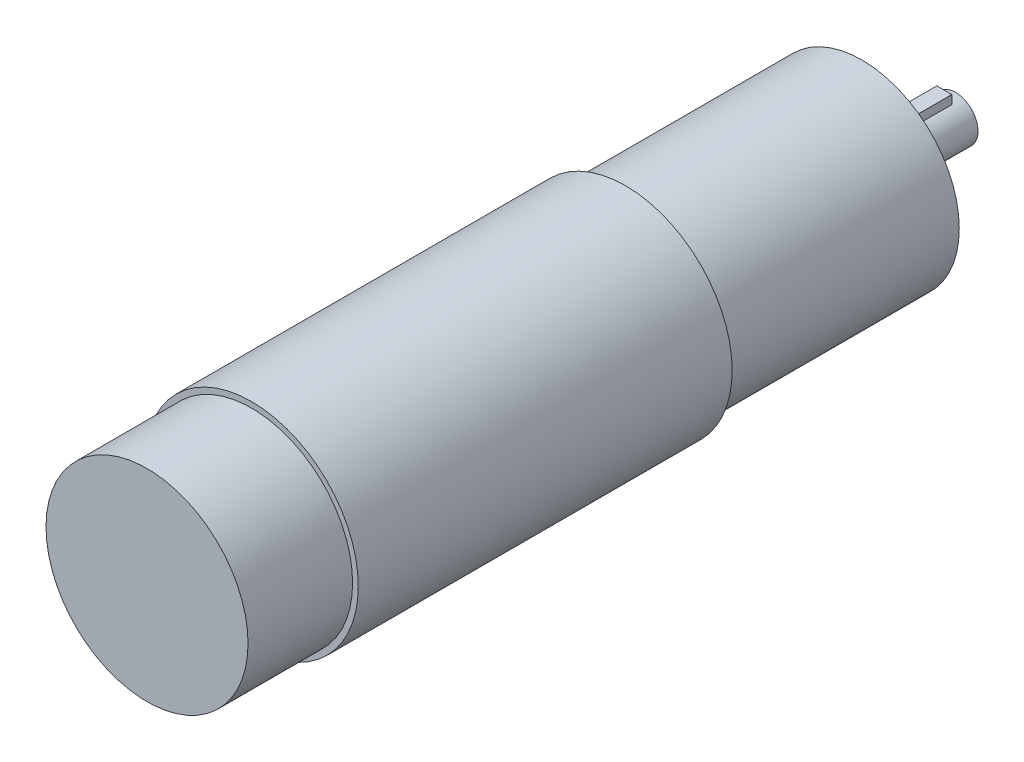
ISO-10303-21;
HEADER;
FILE_DESCRIPTION(('STEP AP214'),'2;1');
FILE_NAME('part.step','',(''),(''),'','','');
FILE_SCHEMA(('AUTOMOTIVE_DESIGN { 1 0 10303 214 1 1 1 1 }'));
ENDSEC;
DATA;
#1=APPLICATION_CONTEXT('core data for automotive mechanical design processes');
#2=APPLICATION_PROTOCOL_DEFINITION('international standard','automotive_design',2000,#1);
#3=PRODUCT_CONTEXT('',#1,'mechanical');
#4=PRODUCT('Part','Part','',(#3));
#5=PRODUCT_RELATED_PRODUCT_CATEGORY('part','',(#4));
#6=PRODUCT_DEFINITION_FORMATION('','',#4);
#7=PRODUCT_DEFINITION_CONTEXT('part definition',#1,'design');
#8=PRODUCT_DEFINITION('design','',#6,#7);
#9=PRODUCT_DEFINITION_SHAPE('','',#8);
#10=(LENGTH_UNIT() NAMED_UNIT(*) SI_UNIT(.MILLI.,.METRE.));
#11=(NAMED_UNIT(*) PLANE_ANGLE_UNIT() SI_UNIT($,.RADIAN.));
#12=(NAMED_UNIT(*) SI_UNIT($,.STERADIAN.) SOLID_ANGLE_UNIT());
#13=UNCERTAINTY_MEASURE_WITH_UNIT(LENGTH_MEASURE(1.E-05),#10,'distance_accuracy_value','');
#14=(GEOMETRIC_REPRESENTATION_CONTEXT(3) GLOBAL_UNCERTAINTY_ASSIGNED_CONTEXT((#13)) GLOBAL_UNIT_ASSIGNED_CONTEXT((#10,
#11,#12)) REPRESENTATION_CONTEXT('',''));
#15=CARTESIAN_POINT('',(0.,0.,0.));
#16=DIRECTION('',(0.,0.,1.));
#17=DIRECTION('',(1.,0.,0.));
#18=AXIS2_PLACEMENT_3D('',#15,#16,#17);
#19=CARTESIAN_POINT('',(0.,0.,0.));
#20=DIRECTION('',(0.,0.,-1.));
#21=DIRECTION('',(-1.,0.,0.));
#22=AXIS2_PLACEMENT_3D('',#19,#20,#21);
#23=PLANE('',#22);
#24=CARTESIAN_POINT('',(0.,0.,0.));
#25=DIRECTION('',(0.,0.,1.));
#26=DIRECTION('',(1.,0.,0.));
#27=AXIS2_PLACEMENT_3D('',#24,#25,#26);
#28=CIRCLE('',#27,26.9875);
#29=CARTESIAN_POINT('',(26.9875,0.,0.));
#30=VERTEX_POINT('',#29);
#31=EDGE_CURVE('E139',#30,#30,#28,.T.);
#32=ORIENTED_EDGE('',*,*,#31,.T.);
#33=EDGE_LOOP('',(#32));
#34=FACE_BOUND('',#33,.T.);
#35=ADVANCED_FACE('F33',(#34),#23,.F.);
#36=CARTESIAN_POINT('',(0.,0.,10.8794824996258));
#37=DIRECTION('',(0.,0.,1.));
#38=DIRECTION('',(1.,0.,0.));
#39=AXIS2_PLACEMENT_3D('',#36,#37,#38);
#40=CYLINDRICAL_SURFACE('',#39,26.9875);
#41=ORIENTED_EDGE('',*,*,#31,.F.);
#42=EDGE_LOOP('',(#41));
#43=FACE_BOUND('',#42,.T.);
#44=CARTESIAN_POINT('',(0.,0.,-27.94));
#45=DIRECTION('',(0.,0.,1.));
#46=DIRECTION('',(1.,0.,0.));
#47=AXIS2_PLACEMENT_3D('',#44,#45,#46);
#48=CIRCLE('',#47,26.9875);
#49=CARTESIAN_POINT('',(26.9875,0.,-27.94));
#50=VERTEX_POINT('',#49);
#51=EDGE_CURVE('E136',#50,#50,#48,.T.);
#52=ORIENTED_EDGE('',*,*,#51,.T.);
#53=EDGE_LOOP('',(#52));
#54=FACE_BOUND('',#53,.T.);
#55=ADVANCED_FACE('F163',(#43,#54),#40,.T.);
#56=CARTESIAN_POINT('',(0.,26.9875,-27.94));
#57=DIRECTION('',(0.,0.,-1.));
#58=DIRECTION('',(-1.,0.,0.));
#59=AXIS2_PLACEMENT_3D('',#56,#57,#58);
#60=PLANE('',#59);
#61=ORIENTED_EDGE('',*,*,#51,.F.);
#62=EDGE_LOOP('',(#61));
#63=FACE_BOUND('',#62,.T.);
#64=CARTESIAN_POINT('',(0.,0.,-27.94));
#65=DIRECTION('',(0.,0.,1.));
#66=DIRECTION('',(1.,0.,0.));
#67=AXIS2_PLACEMENT_3D('',#64,#65,#66);
#68=CIRCLE('',#67,28.5);
#69=CARTESIAN_POINT('',(28.5,0.,-27.94));
#70=VERTEX_POINT('',#69);
#71=EDGE_CURVE('E133',#70,#70,#68,.T.);
#72=ORIENTED_EDGE('',*,*,#71,.T.);
#73=EDGE_LOOP('',(#72));
#74=FACE_BOUND('',#73,.T.);
#75=ADVANCED_FACE('F168',(#63,#74),#60,.F.);
#76=CARTESIAN_POINT('',(0.,0.,10.8794824996258));
#77=DIRECTION('',(0.,0.,1.));
#78=DIRECTION('',(1.,0.,0.));
#79=AXIS2_PLACEMENT_3D('',#76,#77,#78);
#80=CYLINDRICAL_SURFACE('',#79,28.5);
#81=ORIENTED_EDGE('',*,*,#71,.F.);
#82=EDGE_LOOP('',(#81));
#83=FACE_BOUND('',#82,.T.);
#84=CARTESIAN_POINT('',(0.,0.,-127.837178897784));
#85=DIRECTION('',(0.,0.,1.));
#86=DIRECTION('',(1.,0.,0.));
#87=AXIS2_PLACEMENT_3D('',#84,#85,#86);
#88=CIRCLE('',#87,28.5);
#89=CARTESIAN_POINT('',(28.5,0.,-127.837178897784));
#90=VERTEX_POINT('',#89);
#91=EDGE_CURVE('E130',#90,#90,#88,.T.);
#92=ORIENTED_EDGE('',*,*,#91,.T.);
#93=EDGE_LOOP('',(#92));
#94=FACE_BOUND('',#93,.T.);
#95=ADVANCED_FACE('F176',(#83,#94),#80,.T.);
#96=CARTESIAN_POINT('',(0.,28.5,-127.837178897784));
#97=DIRECTION('',(0.,0.,1.));
#98=DIRECTION('',(1.,0.,0.));
#99=AXIS2_PLACEMENT_3D('',#96,#97,#98);
#100=PLANE('',#99);
#101=ORIENTED_EDGE('',*,*,#91,.F.);
#102=EDGE_LOOP('',(#101));
#103=FACE_BOUND('',#102,.T.);
#104=CARTESIAN_POINT('',(0.,0.,-127.837178897784));
#105=DIRECTION('',(0.,0.,1.));
#106=DIRECTION('',(1.,0.,0.));
#107=AXIS2_PLACEMENT_3D('',#104,#105,#106);
#108=CIRCLE('',#107,26.);
#109=CARTESIAN_POINT('',(26.,0.,-127.837178897784));
#110=VERTEX_POINT('',#109);
#111=EDGE_CURVE('E127',#110,#110,#108,.T.);
#112=ORIENTED_EDGE('',*,*,#111,.T.);
#113=EDGE_LOOP('',(#112));
#114=FACE_BOUND('',#113,.T.);
#115=ADVANCED_FACE('F182',(#103,#114),#100,.F.);
#116=CARTESIAN_POINT('',(0.,0.,10.8794824996258));
#117=DIRECTION('',(0.,0.,1.));
#118=DIRECTION('',(1.,0.,0.));
#119=AXIS2_PLACEMENT_3D('',#116,#117,#118);
#120=CYLINDRICAL_SURFACE('',#119,26.);
#121=ORIENTED_EDGE('',*,*,#111,.F.);
#122=EDGE_LOOP('',(#121));
#123=FACE_BOUND('',#122,.T.);
#124=CARTESIAN_POINT('',(0.,0.,-191.008));
#125=DIRECTION('',(0.,0.,1.));
#126=DIRECTION('',(1.,0.,0.));
#127=AXIS2_PLACEMENT_3D('',#124,#125,#126);
#128=CIRCLE('',#127,26.);
#129=CARTESIAN_POINT('',(26.,0.,-191.008));
#130=VERTEX_POINT('',#129);
#131=EDGE_CURVE('E124',#130,#130,#128,.T.);
#132=ORIENTED_EDGE('',*,*,#131,.T.);
#133=EDGE_LOOP('',(#132));
#134=FACE_BOUND('',#133,.T.);
#135=ADVANCED_FACE('F188',(#123,#134),#120,.T.);
#136=CARTESIAN_POINT('',(0.,26.,-191.008));
#137=DIRECTION('',(0.,0.,1.));
#138=DIRECTION('',(1.,0.,0.));
#139=AXIS2_PLACEMENT_3D('',#136,#137,#138);
#140=PLANE('',#139);
#141=ORIENTED_EDGE('',*,*,#131,.F.);
#142=EDGE_LOOP('',(#141));
#143=FACE_BOUND('',#142,.T.);
#144=CARTESIAN_POINT('',(0.,0.,-191.008));
#145=DIRECTION('',(0.,0.,1.));
#146=DIRECTION('',(1.,0.,0.));
#147=AXIS2_PLACEMENT_3D('',#144,#145,#146);
#148=CIRCLE('',#147,16.);
#149=CARTESIAN_POINT('',(16.,0.,-191.008));
#150=VERTEX_POINT('',#149);
#151=EDGE_CURVE('E121',#150,#150,#148,.T.);
#152=ORIENTED_EDGE('',*,*,#151,.T.);
#153=EDGE_LOOP('',(#152));
#154=FACE_BOUND('',#153,.T.);
#155=ADVANCED_FACE('F194',(#143,#154),#140,.F.);
#156=CARTESIAN_POINT('',(0.,0.,10.8794824996258));
#157=DIRECTION('',(0.,0.,1.));
#158=DIRECTION('',(1.,0.,0.));
#159=AXIS2_PLACEMENT_3D('',#156,#157,#158);
#160=CYLINDRICAL_SURFACE('',#159,16.);
#161=ORIENTED_EDGE('',*,*,#151,.F.);
#162=EDGE_LOOP('',(#161));
#163=FACE_BOUND('',#162,.T.);
#164=CARTESIAN_POINT('',(0.,0.,-194.008));
#165=DIRECTION('',(0.,0.,1.));
#166=DIRECTION('',(1.,0.,0.));
#167=AXIS2_PLACEMENT_3D('',#164,#165,#166);
#168=CIRCLE('',#167,16.);
#169=CARTESIAN_POINT('',(16.,0.,-194.008));
#170=VERTEX_POINT('',#169);
#171=EDGE_CURVE('E118',#170,#170,#168,.T.);
#172=ORIENTED_EDGE('',*,*,#171,.T.);
#173=EDGE_LOOP('',(#172));
#174=FACE_BOUND('',#173,.T.);
#175=ADVANCED_FACE('F200',(#163,#174),#160,.T.);
#176=CARTESIAN_POINT('',(0.,16.,-194.008));
#177=DIRECTION('',(0.,0.,1.));
#178=DIRECTION('',(1.,0.,0.));
#179=AXIS2_PLACEMENT_3D('',#176,#177,#178);
#180=PLANE('',#179);
#181=ORIENTED_EDGE('',*,*,#171,.F.);
#182=EDGE_LOOP('',(#181));
#183=FACE_BOUND('',#182,.T.);
#184=CARTESIAN_POINT('',(0.,0.,-194.008));
#185=DIRECTION('',(0.,0.,1.));
#186=DIRECTION('',(1.,0.,0.));
#187=AXIS2_PLACEMENT_3D('',#184,#185,#186);
#188=CIRCLE('',#187,6.);
#189=CARTESIAN_POINT('',(6.,0.,-194.008));
#190=VERTEX_POINT('',#189);
#191=EDGE_CURVE('E115',#190,#190,#188,.T.);
#192=ORIENTED_EDGE('',*,*,#191,.T.);
#193=EDGE_LOOP('',(#192));
#194=FACE_BOUND('',#193,.T.);
#195=ADVANCED_FACE('F206',(#183,#194),#180,.F.);
#196=CARTESIAN_POINT('',(0.,0.,10.8794824996258));
#197=DIRECTION('',(0.,0.,1.));
#198=DIRECTION('',(1.,0.,0.));
#199=AXIS2_PLACEMENT_3D('',#196,#197,#198);
#200=CYLINDRICAL_SURFACE('',#199,6.);
#201=CARTESIAN_POINT('',(0.,0.,-213.008));
#202=DIRECTION('',(0.,0.,1.));
#203=DIRECTION('',(1.,0.,0.));
#204=AXIS2_PLACEMENT_3D('',#201,#202,#203);
#205=CIRCLE('',#204,6.);
#206=CARTESIAN_POINT('',(2.,5.65685424949238,-213.008));
#207=VERTEX_POINT('',#206);
#208=CARTESIAN_POINT('',(-2.,5.65685424949238,-213.008));
#209=VERTEX_POINT('',#208);
#210=EDGE_CURVE('E50',#207,#209,#205,.T.);
#211=ORIENTED_EDGE('',*,*,#210,.F.);
#212=DIRECTION('',(0.,0.,1.));
#213=VECTOR('',#212,1.);
#214=CARTESIAN_POINT('',(2.,5.65685424949238,10.8794824996258));
#215=LINE('',#214,#213);
#216=CARTESIAN_POINT('',(2.,5.65685424949238,-197.008));
#217=VERTEX_POINT('',#216);
#218=EDGE_CURVE('E11',#207,#217,#215,.T.);
#219=ORIENTED_EDGE('',*,*,#218,.T.);
#220=CARTESIAN_POINT('',(0.,0.,-197.008));
#221=DIRECTION('',(0.,0.,-1.));
#222=DIRECTION('',(-1.,0.,0.));
#223=AXIS2_PLACEMENT_3D('',#220,#221,#222);
#224=CIRCLE('',#223,6.);
#225=CARTESIAN_POINT('',(-2.,5.65685424949238,-197.008));
#226=VERTEX_POINT('',#225);
#227=EDGE_CURVE('E40',#226,#217,#224,.T.);
#228=ORIENTED_EDGE('',*,*,#227,.F.);
#229=DIRECTION('',(0.,0.,1.));
#230=VECTOR('',#229,1.);
#231=CARTESIAN_POINT('',(-2.,5.65685424949238,10.8794824996258));
#232=LINE('',#231,#230);
#233=EDGE_CURVE('E142',#209,#226,#232,.T.);
#234=ORIENTED_EDGE('',*,*,#233,.F.);
#235=EDGE_LOOP('',(#211,#219,#228,#234));
#236=FACE_BOUND('',#235,.T.);
#237=ORIENTED_EDGE('',*,*,#191,.F.);
#238=EDGE_LOOP('',(#237));
#239=FACE_BOUND('',#238,.T.);
#240=CARTESIAN_POINT('',(0.,0.,-216.008));
#241=DIRECTION('',(0.,0.,1.));
#242=DIRECTION('',(1.,0.,0.));
#243=AXIS2_PLACEMENT_3D('',#240,#241,#242);
#244=CIRCLE('',#243,6.);
#245=CARTESIAN_POINT('',(6.,0.,-216.008));
#246=VERTEX_POINT('',#245);
#247=EDGE_CURVE('E112',#246,#246,#244,.T.);
#248=ORIENTED_EDGE('',*,*,#247,.T.);
#249=EDGE_LOOP('',(#248));
#250=FACE_BOUND('',#249,.T.);
#251=ADVANCED_FACE('F148',(#236,#239,#250),#200,.T.);
#252=CARTESIAN_POINT('',(0.,6.,-216.008));
#253=DIRECTION('',(0.,0.,1.));
#254=DIRECTION('',(1.,0.,0.));
#255=AXIS2_PLACEMENT_3D('',#252,#253,#254);
#256=PLANE('',#255);
#257=ORIENTED_EDGE('',*,*,#247,.F.);
#258=EDGE_LOOP('',(#257));
#259=FACE_BOUND('',#258,.T.);
#260=CARTESIAN_POINT('',(0.,0.,-216.008));
#261=DIRECTION('',(0.,0.,1.));
#262=DIRECTION('',(1.,0.,0.));
#263=AXIS2_PLACEMENT_3D('',#260,#261,#262);
#264=CIRCLE('',#263,2.159);
#265=CARTESIAN_POINT('',(2.159,0.,-216.008));
#266=VERTEX_POINT('',#265);
#267=EDGE_CURVE('E109',#266,#266,#264,.T.);
#268=ORIENTED_EDGE('',*,*,#267,.T.);
#269=EDGE_LOOP('',(#268));
#270=FACE_BOUND('',#269,.T.);
#271=ADVANCED_FACE('F216',(#259,#270),#256,.F.);
#272=CARTESIAN_POINT('',(0.,0.,-215.4365));
#273=DIRECTION('',(0.,0.,-1.));
#274=DIRECTION('',(-1.,0.,0.));
#275=AXIS2_PLACEMENT_3D('',#272,#273,#274);
#276=CONICAL_SURFACE('',#275,1.5875,0.785398163397446);
#277=ORIENTED_EDGE('',*,*,#267,.F.);
#278=EDGE_LOOP('',(#277));
#279=FACE_BOUND('',#278,.T.);
#280=CARTESIAN_POINT('',(0.,0.,-215.4365));
#281=DIRECTION('',(0.,0.,1.));
#282=DIRECTION('',(1.,0.,0.));
#283=AXIS2_PLACEMENT_3D('',#280,#281,#282);
#284=CIRCLE('',#283,1.5875);
#285=CARTESIAN_POINT('',(1.5875,0.,-215.4365));
#286=VERTEX_POINT('',#285);
#287=EDGE_CURVE('E106',#286,#286,#284,.T.);
#288=ORIENTED_EDGE('',*,*,#287,.T.);
#289=EDGE_LOOP('',(#288));
#290=FACE_BOUND('',#289,.T.);
#291=ADVANCED_FACE('F222',(#279,#290),#276,.F.);
#292=CARTESIAN_POINT('',(0.,0.,10.8794824996258));
#293=DIRECTION('',(0.,0.,1.));
#294=DIRECTION('',(1.,0.,0.));
#295=AXIS2_PLACEMENT_3D('',#292,#293,#294);
#296=CYLINDRICAL_SURFACE('',#295,1.5875);
#297=ORIENTED_EDGE('',*,*,#287,.F.);
#298=EDGE_LOOP('',(#297));
#299=FACE_BOUND('',#298,.T.);
#300=CARTESIAN_POINT('',(0.,0.,-208.008));
#301=DIRECTION('',(0.,0.,1.));
#302=DIRECTION('',(1.,0.,0.));
#303=AXIS2_PLACEMENT_3D('',#300,#301,#302);
#304=CIRCLE('',#303,1.5875);
#305=CARTESIAN_POINT('',(1.5875,0.,-208.008));
#306=VERTEX_POINT('',#305);
#307=EDGE_CURVE('E88',#306,#306,#304,.T.);
#308=ORIENTED_EDGE('',*,*,#307,.T.);
#309=EDGE_LOOP('',(#308));
#310=FACE_BOUND('',#309,.T.);
#311=ADVANCED_FACE('F228',(#299,#310),#296,.F.);
#312=CARTESIAN_POINT('',(0.,0.,-207.054133767294));
#313=DIRECTION('',(0.,0.,-1.));
#314=DIRECTION('',(-1.,0.,0.));
#315=AXIS2_PLACEMENT_3D('',#312,#313,#314);
#316=CONICAL_SURFACE('',#315,0.,1.02974425867665);
#317=ORIENTED_EDGE('',*,*,#307,.F.);
#318=EDGE_LOOP('',(#317));
#319=FACE_BOUND('',#318,.T.);
#320=CARTESIAN_POINT('',(0.,0.,-207.054133767294));
#321=VERTEX_POINT('',#320);
#322=VERTEX_LOOP('',#321);
#323=FACE_BOUND('',#322,.T.);
#324=ADVANCED_FACE('F159',(#319,#323),#316,.F.);
#325=CARTESIAN_POINT('',(2.,0.,0.));
#326=DIRECTION('',(1.,0.,0.));
#327=DIRECTION('',(0.,0.,-1.));
#328=AXIS2_PLACEMENT_3D('',#325,#326,#327);
#329=PLANE('',#328);
#330=ORIENTED_EDGE('',*,*,#218,.F.);
#331=DIRECTION('',(0.,1.,0.));
#332=VECTOR('',#331,1.);
#333=CARTESIAN_POINT('',(2.,8.,-213.008));
#334=LINE('',#333,#332);
#335=CARTESIAN_POINT('',(2.,8.,-213.008));
#336=VERTEX_POINT('',#335);
#337=EDGE_CURVE('E71',#207,#336,#334,.T.);
#338=ORIENTED_EDGE('',*,*,#337,.T.);
#339=DIRECTION('',(0.,0.,1.));
#340=VECTOR('',#339,1.);
#341=CARTESIAN_POINT('',(2.,8.,-197.008));
#342=LINE('',#341,#340);
#343=CARTESIAN_POINT('',(2.,8.,-197.008));
#344=VERTEX_POINT('',#343);
#345=EDGE_CURVE('E76',#336,#344,#342,.T.);
#346=ORIENTED_EDGE('',*,*,#345,.T.);
#347=DIRECTION('',(0.,-1.,0.));
#348=VECTOR('',#347,1.);
#349=CARTESIAN_POINT('',(2.,8.,-197.008));
#350=LINE('',#349,#348);
#351=EDGE_CURVE('E79',#344,#217,#350,.T.);
#352=ORIENTED_EDGE('',*,*,#351,.T.);
#353=EDGE_LOOP('',(#330,#338,#346,#352));
#354=FACE_BOUND('',#353,.T.);
#355=ADVANCED_FACE('F73',(#354),#329,.T.);
#356=CARTESIAN_POINT('',(-2.,0.,0.));
#357=DIRECTION('',(1.,0.,0.));
#358=DIRECTION('',(0.,0.,-1.));
#359=AXIS2_PLACEMENT_3D('',#356,#357,#358);
#360=PLANE('',#359);
#361=DIRECTION('',(0.,1.,0.));
#362=VECTOR('',#361,1.);
#363=CARTESIAN_POINT('',(-2.,8.,-213.008));
#364=LINE('',#363,#362);
#365=CARTESIAN_POINT('',(-2.,8.,-213.008));
#366=VERTEX_POINT('',#365);
#367=EDGE_CURVE('E85',#209,#366,#364,.T.);
#368=ORIENTED_EDGE('',*,*,#367,.F.);
#369=ORIENTED_EDGE('',*,*,#233,.T.);
#370=DIRECTION('',(0.,-1.,0.));
#371=VECTOR('',#370,1.);
#372=CARTESIAN_POINT('',(-2.,8.,-197.008));
#373=LINE('',#372,#371);
#374=CARTESIAN_POINT('',(-2.,8.,-197.008));
#375=VERTEX_POINT('',#374);
#376=EDGE_CURVE('E98',#375,#226,#373,.T.);
#377=ORIENTED_EDGE('',*,*,#376,.F.);
#378=DIRECTION('',(0.,0.,1.));
#379=VECTOR('',#378,1.);
#380=CARTESIAN_POINT('',(-2.,8.,-197.008));
#381=LINE('',#380,#379);
#382=EDGE_CURVE('E102',#366,#375,#381,.T.);
#383=ORIENTED_EDGE('',*,*,#382,.F.);
#384=EDGE_LOOP('',(#368,#369,#377,#383));
#385=FACE_BOUND('',#384,.T.);
#386=ADVANCED_FACE('F151',(#385),#360,.F.);
#387=CARTESIAN_POINT('',(2.,8.,-197.008));
#388=DIRECTION('',(0.,0.,-1.));
#389=DIRECTION('',(-1.,0.,0.));
#390=AXIS2_PLACEMENT_3D('',#387,#388,#389);
#391=PLANE('',#390);
#392=ORIENTED_EDGE('',*,*,#376,.T.);
#393=ORIENTED_EDGE('',*,*,#227,.T.);
#394=ORIENTED_EDGE('',*,*,#351,.F.);
#395=DIRECTION('',(-1.,0.,0.));
#396=VECTOR('',#395,1.);
#397=CARTESIAN_POINT('',(2.,8.,-197.008));
#398=LINE('',#397,#396);
#399=EDGE_CURVE('E89',#344,#375,#398,.T.);
#400=ORIENTED_EDGE('',*,*,#399,.T.);
#401=EDGE_LOOP('',(#392,#393,#394,#400));
#402=FACE_BOUND('',#401,.T.);
#403=ADVANCED_FACE('F146',(#402),#391,.F.);
#404=CARTESIAN_POINT('',(2.,8.,-213.008));
#405=DIRECTION('',(0.,0.,1.));
#406=DIRECTION('',(1.,0.,0.));
#407=AXIS2_PLACEMENT_3D('',#404,#405,#406);
#408=PLANE('',#407);
#409=ORIENTED_EDGE('',*,*,#337,.F.);
#410=ORIENTED_EDGE('',*,*,#210,.T.);
#411=ORIENTED_EDGE('',*,*,#367,.T.);
#412=DIRECTION('',(-1.,0.,0.));
#413=VECTOR('',#412,1.);
#414=CARTESIAN_POINT('',(2.,8.,-213.008));
#415=LINE('',#414,#413);
#416=EDGE_CURVE('E82',#336,#366,#415,.T.);
#417=ORIENTED_EDGE('',*,*,#416,.F.);
#418=EDGE_LOOP('',(#409,#410,#411,#417));
#419=FACE_BOUND('',#418,.T.);
#420=ADVANCED_FACE('F83',(#419),#408,.F.);
#421=CARTESIAN_POINT('',(2.,8.,-197.008));
#422=DIRECTION('',(0.,-1.,0.));
#423=DIRECTION('',(0.,0.,-1.));
#424=AXIS2_PLACEMENT_3D('',#421,#422,#423);
#425=PLANE('',#424);
#426=ORIENTED_EDGE('',*,*,#382,.T.);
#427=ORIENTED_EDGE('',*,*,#399,.F.);
#428=ORIENTED_EDGE('',*,*,#345,.F.);
#429=ORIENTED_EDGE('',*,*,#416,.T.);
#430=EDGE_LOOP('',(#426,#427,#428,#429));
#431=FACE_BOUND('',#430,.T.);
#432=ADVANCED_FACE('F91',(#431),#425,.F.);
#433=CLOSED_SHELL('',(#35,#55,#75,#95,#115,#135,#155,#175,#195,#251,#271,#291,#311,#324,#355,
#386,#403,#420,#432));
#434=MANIFOLD_SOLID_BREP('B2',#433);
#435=ADVANCED_BREP_SHAPE_REPRESENTATION('',(#18,#434),#14);
#436=SHAPE_DEFINITION_REPRESENTATION(#9,#435);
ENDSEC;
END-ISO-10303-21;
